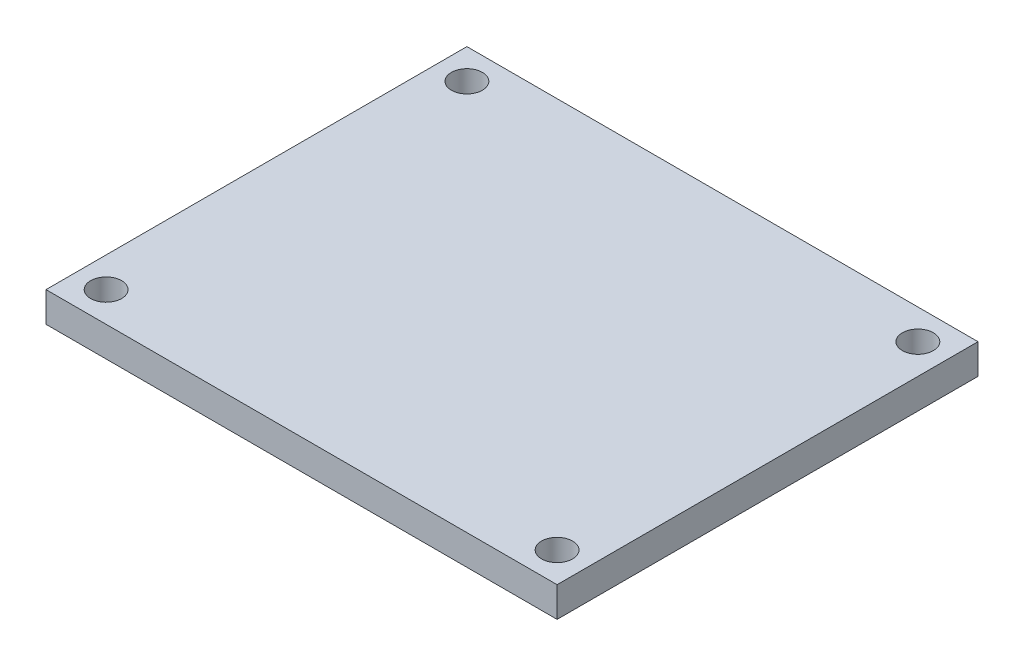
ISO-10303-21;
HEADER;
FILE_DESCRIPTION(('STEP AP214'),'2;1');
FILE_NAME('part.step','',(''),(''),'','','');
FILE_SCHEMA(('AUTOMOTIVE_DESIGN { 1 0 10303 214 1 1 1 1 }'));
ENDSEC;
DATA;
#1=APPLICATION_CONTEXT('core data for automotive mechanical design processes');
#2=APPLICATION_PROTOCOL_DEFINITION('international standard','automotive_design',2000,#1);
#3=PRODUCT_CONTEXT('',#1,'mechanical');
#4=PRODUCT('Part','Part','',(#3));
#5=PRODUCT_RELATED_PRODUCT_CATEGORY('part','',(#4));
#6=PRODUCT_DEFINITION_FORMATION('','',#4);
#7=PRODUCT_DEFINITION_CONTEXT('part definition',#1,'design');
#8=PRODUCT_DEFINITION('design','',#6,#7);
#9=PRODUCT_DEFINITION_SHAPE('','',#8);
#10=(LENGTH_UNIT() NAMED_UNIT(*) SI_UNIT(.MILLI.,.METRE.));
#11=(NAMED_UNIT(*) PLANE_ANGLE_UNIT() SI_UNIT($,.RADIAN.));
#12=(NAMED_UNIT(*) SI_UNIT($,.STERADIAN.) SOLID_ANGLE_UNIT());
#13=UNCERTAINTY_MEASURE_WITH_UNIT(LENGTH_MEASURE(1.E-05),#10,'distance_accuracy_value','');
#14=(GEOMETRIC_REPRESENTATION_CONTEXT(3) GLOBAL_UNCERTAINTY_ASSIGNED_CONTEXT((#13)) GLOBAL_UNIT_ASSIGNED_CONTEXT((#10,
#11,#12)) REPRESENTATION_CONTEXT('',''));
#15=CARTESIAN_POINT('',(0.,0.,0.));
#16=DIRECTION('',(0.,0.,1.));
#17=DIRECTION('',(1.,0.,0.));
#18=AXIS2_PLACEMENT_3D('',#15,#16,#17);
#19=CARTESIAN_POINT('',(0.,5.,0.));
#20=DIRECTION('',(0.,-1.,0.));
#21=DIRECTION('',(0.,0.,-1.));
#22=AXIS2_PLACEMENT_3D('',#19,#20,#21);
#23=PLANE('',#22);
#24=DIRECTION('',(0.,0.,1.));
#25=VECTOR('',#24,1.);
#26=CARTESIAN_POINT('',(0.,5.,0.));
#27=LINE('',#26,#25);
#28=CARTESIAN_POINT('',(0.,5.,-70.));
#29=VERTEX_POINT('',#28);
#30=CARTESIAN_POINT('',(0.,5.,0.));
#31=VERTEX_POINT('',#30);
#32=EDGE_CURVE('E98',#29,#31,#27,.T.);
#33=ORIENTED_EDGE('',*,*,#32,.T.);
#34=DIRECTION('',(1.,0.,0.));
#35=VECTOR('',#34,1.);
#36=CARTESIAN_POINT('',(0.,5.,0.));
#37=LINE('',#36,#35);
#38=CARTESIAN_POINT('',(85.,5.,0.));
#39=VERTEX_POINT('',#38);
#40=EDGE_CURVE('E93',#31,#39,#37,.T.);
#41=ORIENTED_EDGE('',*,*,#40,.T.);
#42=DIRECTION('',(0.,0.,-1.));
#43=VECTOR('',#42,1.);
#44=CARTESIAN_POINT('',(85.,5.,0.));
#45=LINE('',#44,#43);
#46=CARTESIAN_POINT('',(85.,5.,-70.));
#47=VERTEX_POINT('',#46);
#48=EDGE_CURVE('E96',#39,#47,#45,.T.);
#49=ORIENTED_EDGE('',*,*,#48,.T.);
#50=DIRECTION('',(-1.,0.,0.));
#51=VECTOR('',#50,1.);
#52=CARTESIAN_POINT('',(0.,5.,-70.));
#53=LINE('',#52,#51);
#54=EDGE_CURVE('E63',#47,#29,#53,.T.);
#55=ORIENTED_EDGE('',*,*,#54,.T.);
#56=EDGE_LOOP('',(#33,#41,#49,#55));
#57=FACE_BOUND('',#56,.T.);
#58=CARTESIAN_POINT('',(5.,5.,-5.));
#59=DIRECTION('',(0.,1.,0.));
#60=DIRECTION('',(0.,0.,1.));
#61=AXIS2_PLACEMENT_3D('',#58,#59,#60);
#62=CIRCLE('',#61,2.58);
#63=CARTESIAN_POINT('',(5.,5.,-2.42));
#64=VERTEX_POINT('',#63);
#65=EDGE_CURVE('E118',#64,#64,#62,.T.);
#66=ORIENTED_EDGE('',*,*,#65,.F.);
#67=EDGE_LOOP('',(#66));
#68=FACE_BOUND('',#67,.T.);
#69=CARTESIAN_POINT('',(80.,5.,-5.));
#70=DIRECTION('',(0.,1.,0.));
#71=DIRECTION('',(0.,0.,-1.));
#72=AXIS2_PLACEMENT_3D('',#69,#70,#71);
#73=CIRCLE('',#72,2.58000000000001);
#74=CARTESIAN_POINT('',(80.,5.,-7.58000000000001));
#75=VERTEX_POINT('',#74);
#76=EDGE_CURVE('E140',#75,#75,#73,.T.);
#77=ORIENTED_EDGE('',*,*,#76,.F.);
#78=EDGE_LOOP('',(#77));
#79=FACE_BOUND('',#78,.T.);
#80=CARTESIAN_POINT('',(80.,5.,-65.));
#81=DIRECTION('',(0.,1.,0.));
#82=DIRECTION('',(0.,0.,1.));
#83=AXIS2_PLACEMENT_3D('',#80,#81,#82);
#84=CIRCLE('',#83,2.58000000000001);
#85=CARTESIAN_POINT('',(80.,5.,-62.42));
#86=VERTEX_POINT('',#85);
#87=EDGE_CURVE('E148',#86,#86,#84,.T.);
#88=ORIENTED_EDGE('',*,*,#87,.F.);
#89=EDGE_LOOP('',(#88));
#90=FACE_BOUND('',#89,.T.);
#91=CARTESIAN_POINT('',(5.,5.,-65.));
#92=DIRECTION('',(0.,1.,0.));
#93=DIRECTION('',(0.,0.,-1.));
#94=AXIS2_PLACEMENT_3D('',#91,#92,#93);
#95=CIRCLE('',#94,2.58);
#96=CARTESIAN_POINT('',(5.,5.,-67.58));
#97=VERTEX_POINT('',#96);
#98=EDGE_CURVE('E156',#97,#97,#95,.T.);
#99=ORIENTED_EDGE('',*,*,#98,.F.);
#100=EDGE_LOOP('',(#99));
#101=FACE_BOUND('',#100,.T.);
#102=ADVANCED_FACE('F45',(#57,#68,#79,#90,#101),#23,.F.);
#103=CARTESIAN_POINT('',(0.,0.,0.));
#104=DIRECTION('',(0.,-1.,0.));
#105=DIRECTION('',(0.,0.,-1.));
#106=AXIS2_PLACEMENT_3D('',#103,#104,#105);
#107=PLANE('',#106);
#108=CARTESIAN_POINT('',(80.,0.,-65.));
#109=DIRECTION('',(0.,1.,0.));
#110=DIRECTION('',(0.,0.,1.));
#111=AXIS2_PLACEMENT_3D('',#108,#109,#110);
#112=CIRCLE('',#111,2.58000000000001);
#113=CARTESIAN_POINT('',(80.,0.,-62.42));
#114=VERTEX_POINT('',#113);
#115=EDGE_CURVE('E152',#114,#114,#112,.T.);
#116=ORIENTED_EDGE('',*,*,#115,.T.);
#117=EDGE_LOOP('',(#116));
#118=FACE_BOUND('',#117,.T.);
#119=CARTESIAN_POINT('',(5.,0.,-5.));
#120=DIRECTION('',(0.,1.,0.));
#121=DIRECTION('',(0.,0.,1.));
#122=AXIS2_PLACEMENT_3D('',#119,#120,#121);
#123=CIRCLE('',#122,2.58);
#124=CARTESIAN_POINT('',(5.,0.,-2.42));
#125=VERTEX_POINT('',#124);
#126=EDGE_CURVE('E136',#125,#125,#123,.T.);
#127=ORIENTED_EDGE('',*,*,#126,.T.);
#128=EDGE_LOOP('',(#127));
#129=FACE_BOUND('',#128,.T.);
#130=DIRECTION('',(0.,0.,1.));
#131=VECTOR('',#130,1.);
#132=CARTESIAN_POINT('',(0.,0.,0.));
#133=LINE('',#132,#131);
#134=CARTESIAN_POINT('',(0.,0.,-70.));
#135=VERTEX_POINT('',#134);
#136=CARTESIAN_POINT('',(0.,0.,0.));
#137=VERTEX_POINT('',#136);
#138=EDGE_CURVE('E114',#135,#137,#133,.T.);
#139=ORIENTED_EDGE('',*,*,#138,.F.);
#140=DIRECTION('',(-1.,0.,0.));
#141=VECTOR('',#140,1.);
#142=CARTESIAN_POINT('',(0.,0.,-70.));
#143=LINE('',#142,#141);
#144=CARTESIAN_POINT('',(85.,0.,-70.));
#145=VERTEX_POINT('',#144);
#146=EDGE_CURVE('E86',#145,#135,#143,.T.);
#147=ORIENTED_EDGE('',*,*,#146,.F.);
#148=DIRECTION('',(0.,0.,-1.));
#149=VECTOR('',#148,1.);
#150=CARTESIAN_POINT('',(85.,0.,0.));
#151=LINE('',#150,#149);
#152=CARTESIAN_POINT('',(85.,0.,0.));
#153=VERTEX_POINT('',#152);
#154=EDGE_CURVE('E80',#153,#145,#151,.T.);
#155=ORIENTED_EDGE('',*,*,#154,.F.);
#156=DIRECTION('',(1.,0.,0.));
#157=VECTOR('',#156,1.);
#158=CARTESIAN_POINT('',(0.,0.,0.));
#159=LINE('',#158,#157);
#160=EDGE_CURVE('E103',#137,#153,#159,.T.);
#161=ORIENTED_EDGE('',*,*,#160,.F.);
#162=EDGE_LOOP('',(#139,#147,#155,#161));
#163=FACE_BOUND('',#162,.T.);
#164=CARTESIAN_POINT('',(80.,0.,-5.));
#165=DIRECTION('',(0.,1.,0.));
#166=DIRECTION('',(0.,0.,-1.));
#167=AXIS2_PLACEMENT_3D('',#164,#165,#166);
#168=CIRCLE('',#167,2.58000000000001);
#169=CARTESIAN_POINT('',(80.,0.,-7.58000000000001));
#170=VERTEX_POINT('',#169);
#171=EDGE_CURVE('E144',#170,#170,#168,.T.);
#172=ORIENTED_EDGE('',*,*,#171,.T.);
#173=EDGE_LOOP('',(#172));
#174=FACE_BOUND('',#173,.T.);
#175=CARTESIAN_POINT('',(5.,0.,-65.));
#176=DIRECTION('',(0.,1.,0.));
#177=DIRECTION('',(0.,0.,-1.));
#178=AXIS2_PLACEMENT_3D('',#175,#176,#177);
#179=CIRCLE('',#178,2.58);
#180=CARTESIAN_POINT('',(5.,0.,-67.58));
#181=VERTEX_POINT('',#180);
#182=EDGE_CURVE('E160',#181,#181,#179,.T.);
#183=ORIENTED_EDGE('',*,*,#182,.T.);
#184=EDGE_LOOP('',(#183));
#185=FACE_BOUND('',#184,.T.);
#186=ADVANCED_FACE('F131',(#118,#129,#163,#174,#185),#107,.T.);
#187=CARTESIAN_POINT('',(0.,5.,0.));
#188=DIRECTION('',(1.,0.,0.));
#189=DIRECTION('',(0.,0.,-1.));
#190=AXIS2_PLACEMENT_3D('',#187,#188,#189);
#191=PLANE('',#190);
#192=ORIENTED_EDGE('',*,*,#138,.T.);
#193=DIRECTION('',(0.,-1.,0.));
#194=VECTOR('',#193,1.);
#195=CARTESIAN_POINT('',(0.,5.,0.));
#196=LINE('',#195,#194);
#197=EDGE_CURVE('E11',#31,#137,#196,.T.);
#198=ORIENTED_EDGE('',*,*,#197,.F.);
#199=ORIENTED_EDGE('',*,*,#32,.F.);
#200=DIRECTION('',(0.,-1.,0.));
#201=VECTOR('',#200,1.);
#202=CARTESIAN_POINT('',(0.,5.,-70.));
#203=LINE('',#202,#201);
#204=EDGE_CURVE('E110',#29,#135,#203,.T.);
#205=ORIENTED_EDGE('',*,*,#204,.T.);
#206=EDGE_LOOP('',(#192,#198,#199,#205));
#207=FACE_BOUND('',#206,.T.);
#208=ADVANCED_FACE('F47',(#207),#191,.F.);
#209=CARTESIAN_POINT('',(0.,5.,0.));
#210=DIRECTION('',(0.,0.,-1.));
#211=DIRECTION('',(-1.,0.,0.));
#212=AXIS2_PLACEMENT_3D('',#209,#210,#211);
#213=PLANE('',#212);
#214=ORIENTED_EDGE('',*,*,#160,.T.);
#215=DIRECTION('',(0.,-1.,0.));
#216=VECTOR('',#215,1.);
#217=CARTESIAN_POINT('',(85.,5.,0.));
#218=LINE('',#217,#216);
#219=EDGE_CURVE('E55',#39,#153,#218,.T.);
#220=ORIENTED_EDGE('',*,*,#219,.F.);
#221=ORIENTED_EDGE('',*,*,#40,.F.);
#222=ORIENTED_EDGE('',*,*,#197,.T.);
#223=EDGE_LOOP('',(#214,#220,#221,#222));
#224=FACE_BOUND('',#223,.T.);
#225=ADVANCED_FACE('F102',(#224),#213,.F.);
#226=CARTESIAN_POINT('',(85.,5.,0.));
#227=DIRECTION('',(-1.,0.,0.));
#228=DIRECTION('',(0.,0.,1.));
#229=AXIS2_PLACEMENT_3D('',#226,#227,#228);
#230=PLANE('',#229);
#231=ORIENTED_EDGE('',*,*,#154,.T.);
#232=DIRECTION('',(0.,-1.,0.));
#233=VECTOR('',#232,1.);
#234=CARTESIAN_POINT('',(85.,5.,-70.));
#235=LINE('',#234,#233);
#236=EDGE_CURVE('E105',#47,#145,#235,.T.);
#237=ORIENTED_EDGE('',*,*,#236,.F.);
#238=ORIENTED_EDGE('',*,*,#48,.F.);
#239=ORIENTED_EDGE('',*,*,#219,.T.);
#240=EDGE_LOOP('',(#231,#237,#238,#239));
#241=FACE_BOUND('',#240,.T.);
#242=ADVANCED_FACE('F106',(#241),#230,.F.);
#243=CARTESIAN_POINT('',(0.,5.,-70.));
#244=DIRECTION('',(0.,0.,1.));
#245=DIRECTION('',(1.,0.,0.));
#246=AXIS2_PLACEMENT_3D('',#243,#244,#245);
#247=PLANE('',#246);
#248=ORIENTED_EDGE('',*,*,#146,.T.);
#249=ORIENTED_EDGE('',*,*,#204,.F.);
#250=ORIENTED_EDGE('',*,*,#54,.F.);
#251=ORIENTED_EDGE('',*,*,#236,.T.);
#252=EDGE_LOOP('',(#248,#249,#250,#251));
#253=FACE_BOUND('',#252,.T.);
#254=ADVANCED_FACE('F128',(#253),#247,.F.);
#255=CARTESIAN_POINT('',(5.,5.,-5.));
#256=DIRECTION('',(0.,-1.,0.));
#257=DIRECTION('',(0.,0.,-1.));
#258=AXIS2_PLACEMENT_3D('',#255,#256,#257);
#259=CYLINDRICAL_SURFACE('',#258,2.58);
#260=ORIENTED_EDGE('',*,*,#65,.T.);
#261=EDGE_LOOP('',(#260));
#262=FACE_BOUND('',#261,.T.);
#263=ORIENTED_EDGE('',*,*,#126,.F.);
#264=EDGE_LOOP('',(#263));
#265=FACE_BOUND('',#264,.T.);
#266=ADVANCED_FACE('F179',(#262,#265),#259,.F.);
#267=CARTESIAN_POINT('',(80.,5.,-5.));
#268=DIRECTION('',(0.,-1.,0.));
#269=DIRECTION('',(0.,0.,-1.));
#270=AXIS2_PLACEMENT_3D('',#267,#268,#269);
#271=CYLINDRICAL_SURFACE('',#270,2.58000000000001);
#272=ORIENTED_EDGE('',*,*,#76,.T.);
#273=EDGE_LOOP('',(#272));
#274=FACE_BOUND('',#273,.T.);
#275=ORIENTED_EDGE('',*,*,#171,.F.);
#276=EDGE_LOOP('',(#275));
#277=FACE_BOUND('',#276,.T.);
#278=ADVANCED_FACE('F224',(#274,#277),#271,.F.);
#279=CARTESIAN_POINT('',(80.,5.,-65.));
#280=DIRECTION('',(0.,-1.,0.));
#281=DIRECTION('',(0.,0.,-1.));
#282=AXIS2_PLACEMENT_3D('',#279,#280,#281);
#283=CYLINDRICAL_SURFACE('',#282,2.58000000000001);
#284=ORIENTED_EDGE('',*,*,#87,.T.);
#285=EDGE_LOOP('',(#284));
#286=FACE_BOUND('',#285,.T.);
#287=ORIENTED_EDGE('',*,*,#115,.F.);
#288=EDGE_LOOP('',(#287));
#289=FACE_BOUND('',#288,.T.);
#290=ADVANCED_FACE('F232',(#286,#289),#283,.F.);
#291=CARTESIAN_POINT('',(5.,5.,-65.));
#292=DIRECTION('',(0.,-1.,0.));
#293=DIRECTION('',(0.,0.,-1.));
#294=AXIS2_PLACEMENT_3D('',#291,#292,#293);
#295=CYLINDRICAL_SURFACE('',#294,2.58);
#296=ORIENTED_EDGE('',*,*,#98,.T.);
#297=EDGE_LOOP('',(#296));
#298=FACE_BOUND('',#297,.T.);
#299=ORIENTED_EDGE('',*,*,#182,.F.);
#300=EDGE_LOOP('',(#299));
#301=FACE_BOUND('',#300,.T.);
#302=ADVANCED_FACE('F168',(#298,#301),#295,.F.);
#303=CLOSED_SHELL('',(#102,#186,#208,#225,#242,#254,#266,#278,#290,#302));
#304=MANIFOLD_SOLID_BREP('B2',#303);
#305=ADVANCED_BREP_SHAPE_REPRESENTATION('',(#18,#304),#14);
#306=SHAPE_DEFINITION_REPRESENTATION(#9,#305);
ENDSEC;
END-ISO-10303-21;
